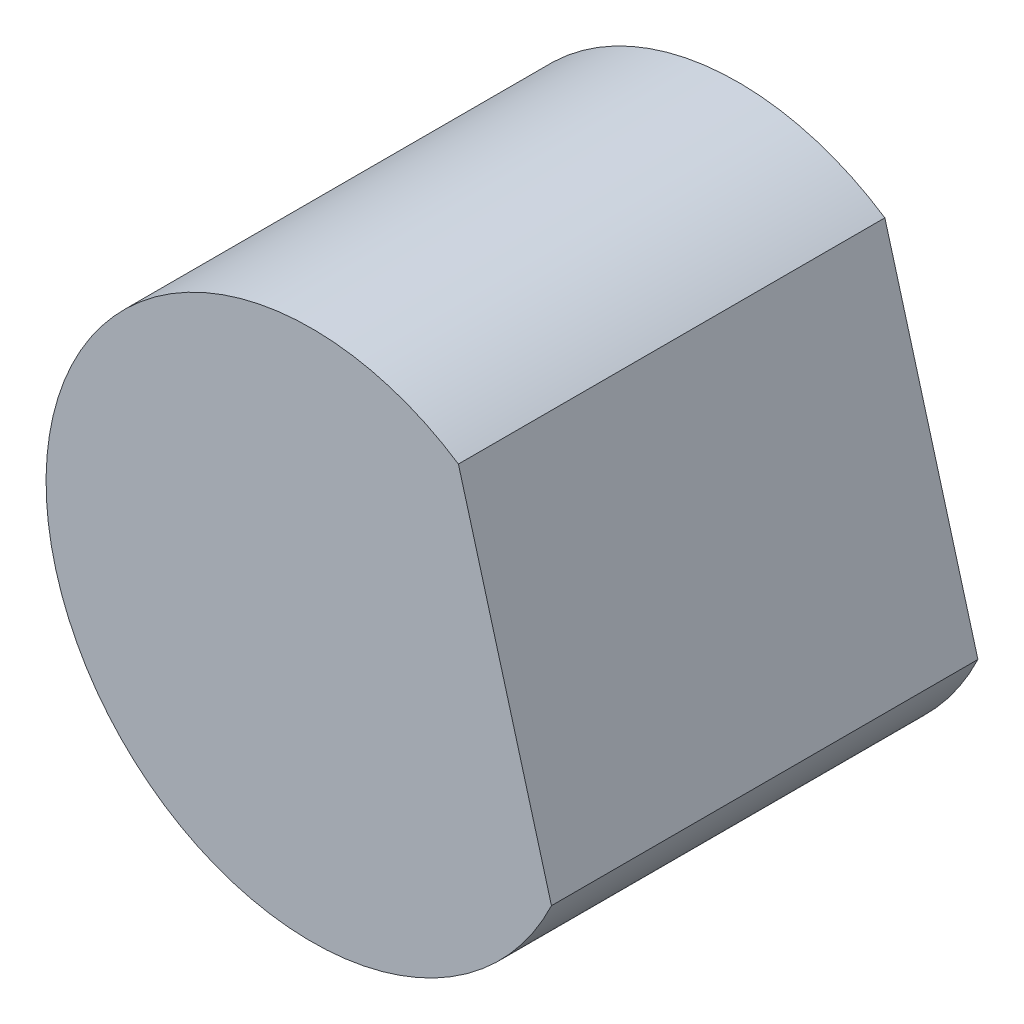
ISO-10303-21;
HEADER;
FILE_DESCRIPTION(('STEP AP214'),'2;1');
FILE_NAME('part.step','',(''),(''),'','','');
FILE_SCHEMA(('AUTOMOTIVE_DESIGN { 1 0 10303 214 1 1 1 1 }'));
ENDSEC;
DATA;
#1=APPLICATION_CONTEXT('core data for automotive mechanical design processes');
#2=APPLICATION_PROTOCOL_DEFINITION('international standard','automotive_design',2000,#1);
#3=PRODUCT_CONTEXT('',#1,'mechanical');
#4=PRODUCT('Part','Part','',(#3));
#5=PRODUCT_RELATED_PRODUCT_CATEGORY('part','',(#4));
#6=PRODUCT_DEFINITION_FORMATION('','',#4);
#7=PRODUCT_DEFINITION_CONTEXT('part definition',#1,'design');
#8=PRODUCT_DEFINITION('design','',#6,#7);
#9=PRODUCT_DEFINITION_SHAPE('','',#8);
#10=(LENGTH_UNIT() NAMED_UNIT(*) SI_UNIT(.MILLI.,.METRE.));
#11=(NAMED_UNIT(*) PLANE_ANGLE_UNIT() SI_UNIT($,.RADIAN.));
#12=(NAMED_UNIT(*) SI_UNIT($,.STERADIAN.) SOLID_ANGLE_UNIT());
#13=UNCERTAINTY_MEASURE_WITH_UNIT(LENGTH_MEASURE(1.E-05),#10,'distance_accuracy_value','');
#14=(GEOMETRIC_REPRESENTATION_CONTEXT(3) GLOBAL_UNCERTAINTY_ASSIGNED_CONTEXT((#13)) GLOBAL_UNIT_ASSIGNED_CONTEXT((#10,
#11,#12)) REPRESENTATION_CONTEXT('',''));
#15=CARTESIAN_POINT('',(0.,0.,0.));
#16=DIRECTION('',(0.,0.,1.));
#17=DIRECTION('',(1.,0.,0.));
#18=AXIS2_PLACEMENT_3D('',#15,#16,#17);
#19=CARTESIAN_POINT('',(0.,0.,61.));
#20=DIRECTION('',(0.,0.,-1.));
#21=DIRECTION('',(-1.,0.,0.));
#22=AXIS2_PLACEMENT_3D('',#19,#20,#21);
#23=CYLINDRICAL_SURFACE('',#22,38.);
#24=CARTESIAN_POINT('',(0.,0.,61.));
#25=DIRECTION('',(0.,0.,1.));
#26=DIRECTION('',(1.,0.,0.));
#27=AXIS2_PLACEMENT_3D('',#24,#25,#26);
#28=CIRCLE('',#27,38.);
#29=CARTESIAN_POINT('',(20.9830553369623,31.6814044626493,61.));
#30=VERTEX_POINT('',#29);
#31=CARTESIAN_POINT('',(34.2920092628707,-16.3724799806013,61.));
#32=VERTEX_POINT('',#31);
#33=EDGE_CURVE('E11',#30,#32,#28,.T.);
#34=ORIENTED_EDGE('',*,*,#33,.F.);
#35=DIRECTION('',(0.,0.,-1.));
#36=VECTOR('',#35,1.);
#37=CARTESIAN_POINT('',(20.9830553369623,31.6814044626493,111.977958136337));
#38=LINE('',#37,#36);
#39=CARTESIAN_POINT('',(20.9830553369623,31.6814044626493,0.));
#40=VERTEX_POINT('',#39);
#41=EDGE_CURVE('E56',#30,#40,#38,.T.);
#42=ORIENTED_EDGE('',*,*,#41,.T.);
#43=CARTESIAN_POINT('',(0.,0.,0.));
#44=DIRECTION('',(0.,0.,1.));
#45=DIRECTION('',(1.,0.,0.));
#46=AXIS2_PLACEMENT_3D('',#43,#44,#45);
#47=CIRCLE('',#46,38.);
#48=CARTESIAN_POINT('',(34.2920092628707,-16.3724799806013,0.));
#49=VERTEX_POINT('',#48);
#50=EDGE_CURVE('E36',#40,#49,#47,.T.);
#51=ORIENTED_EDGE('',*,*,#50,.T.);
#52=DIRECTION('',(0.,0.,-1.));
#53=VECTOR('',#52,1.);
#54=CARTESIAN_POINT('',(34.2920092628707,-16.3724799806013,111.977958136337));
#55=LINE('',#54,#53);
#56=EDGE_CURVE('E47',#32,#49,#55,.T.);
#57=ORIENTED_EDGE('',*,*,#56,.F.);
#58=EDGE_LOOP('',(#34,#42,#51,#57));
#59=FACE_BOUND('',#58,.T.);
#60=ADVANCED_FACE('F33',(#59),#23,.T.);
#61=CARTESIAN_POINT('',(0.,0.,61.));
#62=DIRECTION('',(0.,0.,1.));
#63=DIRECTION('',(1.,0.,0.));
#64=AXIS2_PLACEMENT_3D('',#61,#62,#63);
#65=PLANE('',#64);
#66=DIRECTION('',(-0.266911202319516,0.963721126714752,0.));
#67=VECTOR('',#66,1.);
#68=CARTESIAN_POINT('',(34.2920092628707,-16.3724799806013,61.));
#69=LINE('',#68,#67);
#70=EDGE_CURVE('E59',#32,#30,#69,.T.);
#71=ORIENTED_EDGE('',*,*,#70,.T.);
#72=ORIENTED_EDGE('',*,*,#33,.T.);
#73=EDGE_LOOP('',(#71,#72));
#74=FACE_BOUND('',#73,.T.);
#75=ADVANCED_FACE('F66',(#74),#65,.T.);
#76=CARTESIAN_POINT('',(0.,0.,0.));
#77=DIRECTION('',(0.,0.,1.));
#78=DIRECTION('',(1.,0.,0.));
#79=AXIS2_PLACEMENT_3D('',#76,#77,#78);
#80=PLANE('',#79);
#81=ORIENTED_EDGE('',*,*,#50,.F.);
#82=DIRECTION('',(-0.266911202319516,0.963721126714752,0.));
#83=VECTOR('',#82,1.);
#84=CARTESIAN_POINT('',(34.2920092628707,-16.3724799806013,0.));
#85=LINE('',#84,#83);
#86=EDGE_CURVE('E52',#49,#40,#85,.T.);
#87=ORIENTED_EDGE('',*,*,#86,.F.);
#88=EDGE_LOOP('',(#81,#87));
#89=FACE_BOUND('',#88,.T.);
#90=ADVANCED_FACE('F71',(#89),#80,.F.);
#91=CARTESIAN_POINT('',(34.2920092628707,-16.3724799806013,111.977958136337));
#92=DIRECTION('',(-0.963721126714752,-0.266911202319516,0.));
#93=DIRECTION('',(0.266911202319516,-0.963721126714752,0.));
#94=AXIS2_PLACEMENT_3D('',#91,#92,#93);
#95=PLANE('',#94);
#96=ORIENTED_EDGE('',*,*,#56,.T.);
#97=ORIENTED_EDGE('',*,*,#86,.T.);
#98=ORIENTED_EDGE('',*,*,#41,.F.);
#99=ORIENTED_EDGE('',*,*,#70,.F.);
#100=EDGE_LOOP('',(#96,#97,#98,#99));
#101=FACE_BOUND('',#100,.T.);
#102=ADVANCED_FACE('F58',(#101),#95,.F.);
#103=CLOSED_SHELL('',(#60,#75,#90,#102));
#104=MANIFOLD_SOLID_BREP('B2',#103);
#105=ADVANCED_BREP_SHAPE_REPRESENTATION('',(#18,#104),#14);
#106=SHAPE_DEFINITION_REPRESENTATION(#9,#105);
ENDSEC;
END-ISO-10303-21;
